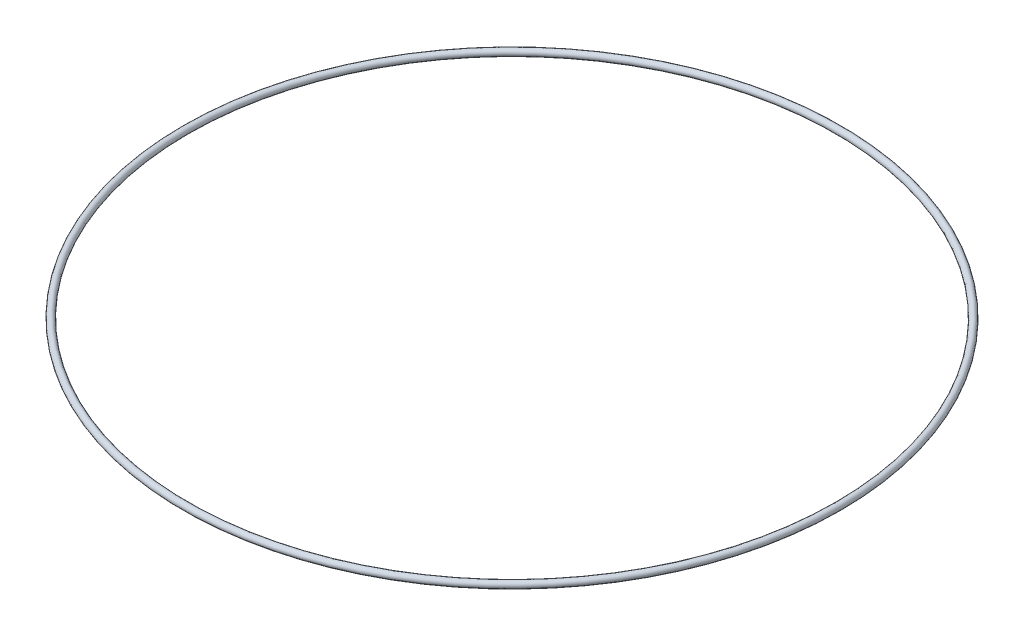
ISO-10303-21;
HEADER;
FILE_DESCRIPTION(('STEP AP214'),'2;1');
FILE_NAME('part.step','',(''),(''),'','','');
FILE_SCHEMA(('AUTOMOTIVE_DESIGN { 1 0 10303 214 1 1 1 1 }'));
ENDSEC;
DATA;
#1=APPLICATION_CONTEXT('core data for automotive mechanical design processes');
#2=APPLICATION_PROTOCOL_DEFINITION('international standard','automotive_design',2000,#1);
#3=PRODUCT_CONTEXT('',#1,'mechanical');
#4=PRODUCT('Part','Part','',(#3));
#5=PRODUCT_RELATED_PRODUCT_CATEGORY('part','',(#4));
#6=PRODUCT_DEFINITION_FORMATION('','',#4);
#7=PRODUCT_DEFINITION_CONTEXT('part definition',#1,'design');
#8=PRODUCT_DEFINITION('design','',#6,#7);
#9=PRODUCT_DEFINITION_SHAPE('','',#8);
#10=(LENGTH_UNIT() NAMED_UNIT(*) SI_UNIT(.MILLI.,.METRE.));
#11=(NAMED_UNIT(*) PLANE_ANGLE_UNIT() SI_UNIT($,.RADIAN.));
#12=(NAMED_UNIT(*) SI_UNIT($,.STERADIAN.) SOLID_ANGLE_UNIT());
#13=UNCERTAINTY_MEASURE_WITH_UNIT(LENGTH_MEASURE(1.E-05),#10,'distance_accuracy_value','');
#14=(GEOMETRIC_REPRESENTATION_CONTEXT(3) GLOBAL_UNCERTAINTY_ASSIGNED_CONTEXT((#13)) GLOBAL_UNIT_ASSIGNED_CONTEXT((#10,
#11,#12)) REPRESENTATION_CONTEXT('',''));
#15=CARTESIAN_POINT('',(0.,0.,0.));
#16=DIRECTION('',(0.,0.,1.));
#17=DIRECTION('',(1.,0.,0.));
#18=AXIS2_PLACEMENT_3D('',#15,#16,#17);
#19=CARTESIAN_POINT('',(0.,-224.794004950737,0.));
#20=DIRECTION('',(0.,1.,0.));
#21=DIRECTION('',(-1.,0.,0.));
#22=AXIS2_PLACEMENT_3D('',#19,#20,#21);
#23=TOROIDAL_SURFACE('',#22,914.4,9.52500000000002);
#24=CARTESIAN_POINT('',(-923.925,-224.794004950737,0.));
#25=VERTEX_POINT('',#24);
#26=VERTEX_LOOP('',#25);
#27=FACE_BOUND('',#26,.T.);
#28=ADVANCED_FACE('F36',(#27),#23,.T.);
#29=CLOSED_SHELL('',(#28));
#30=CARTESIAN_POINT('',(0.,-224.794004950737,0.));
#31=DIRECTION('',(0.,1.,0.));
#32=DIRECTION('',(-1.,0.,0.));
#33=AXIS2_PLACEMENT_3D('',#30,#31,#32);
#34=TOROIDAL_SURFACE('',#33,914.4,7.61999999999997);
#35=CARTESIAN_POINT('',(-922.02,-224.794004950737,0.));
#36=VERTEX_POINT('',#35);
#37=VERTEX_LOOP('',#36);
#38=FACE_BOUND('',#37,.T.);
#39=ADVANCED_FACE('F50',(#38),#34,.F.);
#40=CLOSED_SHELL('',(#39));
#41=ORIENTED_CLOSED_SHELL('',*,#40,.T.);
#42=BREP_WITH_VOIDS('B2',#29,(#41));
#43=ADVANCED_BREP_SHAPE_REPRESENTATION('',(#18,#42),#14);
#44=SHAPE_DEFINITION_REPRESENTATION(#9,#43);
ENDSEC;
END-ISO-10303-21;
